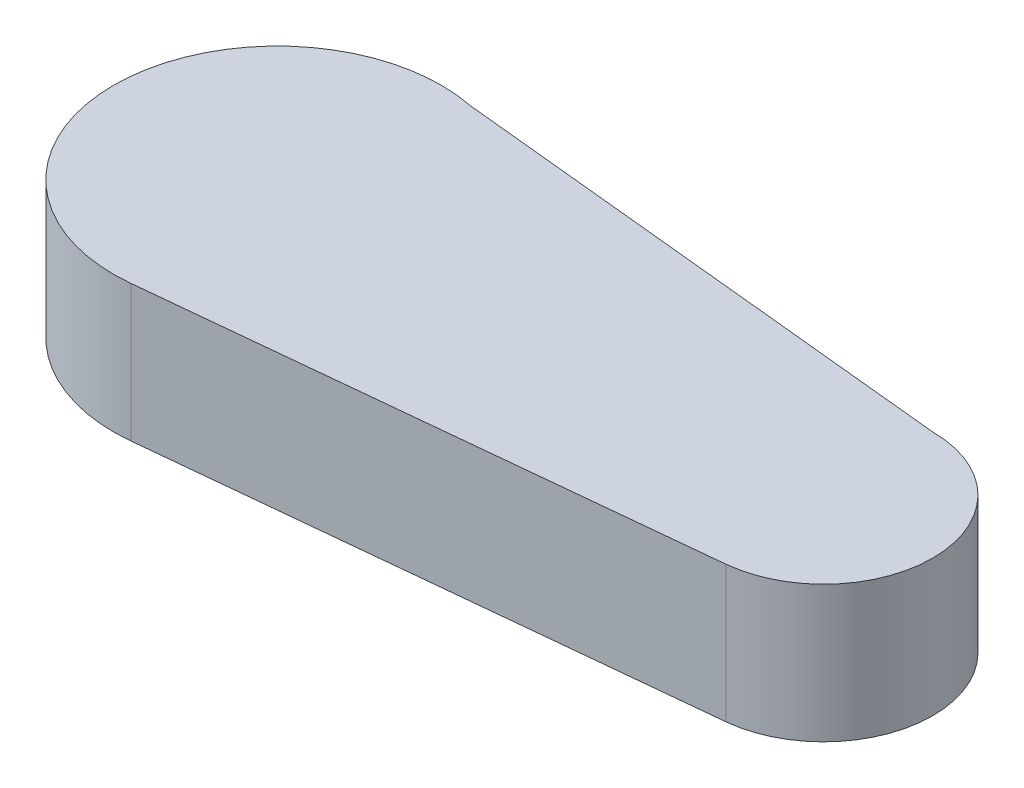
ISO-10303-21;
HEADER;
FILE_DESCRIPTION(('STEP AP214'),'2;1');
FILE_NAME('part.step','',(''),(''),'','','');
FILE_SCHEMA(('AUTOMOTIVE_DESIGN { 1 0 10303 214 1 1 1 1 }'));
ENDSEC;
DATA;
#1=APPLICATION_CONTEXT('core data for automotive mechanical design processes');
#2=APPLICATION_PROTOCOL_DEFINITION('international standard','automotive_design',2000,#1);
#3=PRODUCT_CONTEXT('',#1,'mechanical');
#4=PRODUCT('Part','Part','',(#3));
#5=PRODUCT_RELATED_PRODUCT_CATEGORY('part','',(#4));
#6=PRODUCT_DEFINITION_FORMATION('','',#4);
#7=PRODUCT_DEFINITION_CONTEXT('part definition',#1,'design');
#8=PRODUCT_DEFINITION('design','',#6,#7);
#9=PRODUCT_DEFINITION_SHAPE('','',#8);
#10=(LENGTH_UNIT() NAMED_UNIT(*) SI_UNIT(.MILLI.,.METRE.));
#11=(NAMED_UNIT(*) PLANE_ANGLE_UNIT() SI_UNIT($,.RADIAN.));
#12=(NAMED_UNIT(*) SI_UNIT($,.STERADIAN.) SOLID_ANGLE_UNIT());
#13=UNCERTAINTY_MEASURE_WITH_UNIT(LENGTH_MEASURE(1.E-05),#10,'distance_accuracy_value','');
#14=(GEOMETRIC_REPRESENTATION_CONTEXT(3) GLOBAL_UNCERTAINTY_ASSIGNED_CONTEXT((#13)) GLOBAL_UNIT_ASSIGNED_CONTEXT((#10,
#11,#12)) REPRESENTATION_CONTEXT('',''));
#15=CARTESIAN_POINT('',(0.,0.,0.));
#16=DIRECTION('',(0.,0.,1.));
#17=DIRECTION('',(1.,0.,0.));
#18=AXIS2_PLACEMENT_3D('',#15,#16,#17);
#19=CARTESIAN_POINT('',(-47.3087818696884,25.,0.));
#20=DIRECTION('',(0.,-1.,0.));
#21=DIRECTION('',(0.,0.,-1.));
#22=AXIS2_PLACEMENT_3D('',#19,#20,#21);
#23=CYLINDRICAL_SURFACE('',#22,30.);
#24=CARTESIAN_POINT('',(-47.3087818696884,0.,0.));
#25=DIRECTION('',(0.,1.,0.));
#26=DIRECTION('',(0.,0.,1.));
#27=AXIS2_PLACEMENT_3D('',#24,#25,#26);
#28=CIRCLE('',#27,30.);
#29=CARTESIAN_POINT('',(-41.3681878102824,0.,-29.4059405940594));
#30=VERTEX_POINT('',#29);
#31=CARTESIAN_POINT('',(-44.3087818696884,0.,29.8496231131986));
#32=VERTEX_POINT('',#31);
#33=EDGE_CURVE('E102',#30,#32,#28,.T.);
#34=ORIENTED_EDGE('',*,*,#33,.T.);
#35=DIRECTION('',(0.,-1.,0.));
#36=VECTOR('',#35,1.);
#37=CARTESIAN_POINT('',(-44.3087818696884,25.,29.8496231131986));
#38=LINE('',#37,#36);
#39=CARTESIAN_POINT('',(-44.3087818696884,25.,29.8496231131986));
#40=VERTEX_POINT('',#39);
#41=EDGE_CURVE('E11',#40,#32,#38,.T.);
#42=ORIENTED_EDGE('',*,*,#41,.F.);
#43=CARTESIAN_POINT('',(-47.3087818696884,25.,0.));
#44=DIRECTION('',(0.,1.,0.));
#45=DIRECTION('',(0.,0.,1.));
#46=AXIS2_PLACEMENT_3D('',#43,#44,#45);
#47=CIRCLE('',#46,30.);
#48=CARTESIAN_POINT('',(-41.3681878102824,25.,-29.4059405940594));
#49=VERTEX_POINT('',#48);
#50=EDGE_CURVE('E87',#49,#40,#47,.T.);
#51=ORIENTED_EDGE('',*,*,#50,.F.);
#52=DIRECTION('',(0.,-1.,0.));
#53=VECTOR('',#52,1.);
#54=CARTESIAN_POINT('',(-41.3681878102824,25.,-29.4059405940594));
#55=LINE('',#54,#53);
#56=EDGE_CURVE('E100',#49,#30,#55,.T.);
#57=ORIENTED_EDGE('',*,*,#56,.T.);
#58=EDGE_LOOP('',(#34,#42,#51,#57));
#59=FACE_BOUND('',#58,.T.);
#60=ADVANCED_FACE('F36',(#59),#23,.T.);
#61=CARTESIAN_POINT('',(-44.3087818696884,25.,29.8496231131986));
#62=DIRECTION('',(-0.1,0.,-0.99498743710662));
#63=DIRECTION('',(-0.99498743710662,0.,0.1));
#64=AXIS2_PLACEMENT_3D('',#61,#62,#63);
#65=PLANE('',#64);
#66=DIRECTION('',(0.99498743710662,0.,-0.1));
#67=VECTOR('',#66,1.);
#68=CARTESIAN_POINT('',(-44.3087818696884,0.,29.8496231131986));
#69=LINE('',#68,#67);
#70=CARTESIAN_POINT('',(54.6912181303116,0.,19.8997487421324));
#71=VERTEX_POINT('',#70);
#72=EDGE_CURVE('E93',#32,#71,#69,.T.);
#73=ORIENTED_EDGE('',*,*,#72,.T.);
#74=DIRECTION('',(0.,-1.,0.));
#75=VECTOR('',#74,1.);
#76=CARTESIAN_POINT('',(54.6912181303116,25.,19.8997487421324));
#77=LINE('',#76,#75);
#78=CARTESIAN_POINT('',(54.6912181303116,25.,19.8997487421324));
#79=VERTEX_POINT('',#78);
#80=EDGE_CURVE('E46',#79,#71,#77,.T.);
#81=ORIENTED_EDGE('',*,*,#80,.F.);
#82=DIRECTION('',(0.99498743710662,0.,-0.1));
#83=VECTOR('',#82,1.);
#84=CARTESIAN_POINT('',(-44.3087818696884,25.,29.8496231131986));
#85=LINE('',#84,#83);
#86=EDGE_CURVE('E84',#40,#79,#85,.T.);
#87=ORIENTED_EDGE('',*,*,#86,.F.);
#88=ORIENTED_EDGE('',*,*,#41,.T.);
#89=EDGE_LOOP('',(#73,#81,#87,#88));
#90=FACE_BOUND('',#89,.T.);
#91=ADVANCED_FACE('F95',(#90),#65,.F.);
#92=CARTESIAN_POINT('',(52.6912181303116,25.,0.));
#93=DIRECTION('',(0.,-1.,0.));
#94=DIRECTION('',(0.,0.,-1.));
#95=AXIS2_PLACEMENT_3D('',#92,#93,#94);
#96=CYLINDRICAL_SURFACE('',#95,20.);
#97=CARTESIAN_POINT('',(52.6912181303116,0.,0.));
#98=DIRECTION('',(0.,1.,0.));
#99=DIRECTION('',(0.,0.,1.));
#100=AXIS2_PLACEMENT_3D('',#97,#98,#99);
#101=CIRCLE('',#100,20.);
#102=CARTESIAN_POINT('',(52.6912181303116,0.,-20.));
#103=VERTEX_POINT('',#102);
#104=EDGE_CURVE('E71',#71,#103,#101,.T.);
#105=ORIENTED_EDGE('',*,*,#104,.T.);
#106=DIRECTION('',(0.,-1.,0.));
#107=VECTOR('',#106,1.);
#108=CARTESIAN_POINT('',(52.6912181303116,25.,-20.));
#109=LINE('',#108,#107);
#110=CARTESIAN_POINT('',(52.6912181303116,25.,-20.));
#111=VERTEX_POINT('',#110);
#112=EDGE_CURVE('E92',#111,#103,#109,.T.);
#113=ORIENTED_EDGE('',*,*,#112,.F.);
#114=CARTESIAN_POINT('',(52.6912181303116,25.,0.));
#115=DIRECTION('',(0.,1.,0.));
#116=DIRECTION('',(0.,0.,1.));
#117=AXIS2_PLACEMENT_3D('',#114,#115,#116);
#118=CIRCLE('',#117,20.);
#119=EDGE_CURVE('E90',#79,#111,#118,.T.);
#120=ORIENTED_EDGE('',*,*,#119,.F.);
#121=ORIENTED_EDGE('',*,*,#80,.T.);
#122=EDGE_LOOP('',(#105,#113,#120,#121));
#123=FACE_BOUND('',#122,.T.);
#124=ADVANCED_FACE('F94',(#123),#96,.T.);
#125=CARTESIAN_POINT('',(-41.3681878102824,25.,-29.4059405940594));
#126=DIRECTION('',(-0.0995037190209988,0.,0.995037190209989));
#127=DIRECTION('',(0.995037190209989,0.,0.0995037190209988));
#128=AXIS2_PLACEMENT_3D('',#125,#126,#127);
#129=PLANE('',#128);
#130=DIRECTION('',(-0.995037190209989,0.,-0.0995037190209988));
#131=VECTOR('',#130,1.);
#132=CARTESIAN_POINT('',(-41.3681878102824,0.,-29.4059405940594));
#133=LINE('',#132,#131);
#134=EDGE_CURVE('E77',#103,#30,#133,.T.);
#135=ORIENTED_EDGE('',*,*,#134,.T.);
#136=ORIENTED_EDGE('',*,*,#56,.F.);
#137=DIRECTION('',(-0.995037190209989,0.,-0.0995037190209988));
#138=VECTOR('',#137,1.);
#139=CARTESIAN_POINT('',(-41.3681878102824,25.,-29.4059405940594));
#140=LINE('',#139,#138);
#141=EDGE_CURVE('E53',#111,#49,#140,.T.);
#142=ORIENTED_EDGE('',*,*,#141,.F.);
#143=ORIENTED_EDGE('',*,*,#112,.T.);
#144=EDGE_LOOP('',(#135,#136,#142,#143));
#145=FACE_BOUND('',#144,.T.);
#146=ADVANCED_FACE('F106',(#145),#129,.F.);
#147=CARTESIAN_POINT('',(-47.3087818696884,25.,0.));
#148=DIRECTION('',(0.,1.,0.));
#149=DIRECTION('',(0.,0.,1.));
#150=AXIS2_PLACEMENT_3D('',#147,#148,#149);
#151=PLANE('',#150);
#152=ORIENTED_EDGE('',*,*,#50,.T.);
#153=ORIENTED_EDGE('',*,*,#86,.T.);
#154=ORIENTED_EDGE('',*,*,#119,.T.);
#155=ORIENTED_EDGE('',*,*,#141,.T.);
#156=EDGE_LOOP('',(#152,#153,#154,#155));
#157=FACE_BOUND('',#156,.T.);
#158=ADVANCED_FACE('F82',(#157),#151,.T.);
#159=CARTESIAN_POINT('',(-47.3087818696884,0.,0.));
#160=DIRECTION('',(0.,1.,0.));
#161=DIRECTION('',(0.,0.,1.));
#162=AXIS2_PLACEMENT_3D('',#159,#160,#161);
#163=PLANE('',#162);
#164=ORIENTED_EDGE('',*,*,#33,.F.);
#165=ORIENTED_EDGE('',*,*,#134,.F.);
#166=ORIENTED_EDGE('',*,*,#104,.F.);
#167=ORIENTED_EDGE('',*,*,#72,.F.);
#168=EDGE_LOOP('',(#164,#165,#166,#167));
#169=FACE_BOUND('',#168,.T.);
#170=ADVANCED_FACE('F112',(#169),#163,.F.);
#171=CLOSED_SHELL('',(#60,#91,#124,#146,#158,#170));
#172=MANIFOLD_SOLID_BREP('B2',#171);
#173=ADVANCED_BREP_SHAPE_REPRESENTATION('',(#18,#172),#14);
#174=SHAPE_DEFINITION_REPRESENTATION(#9,#173);
ENDSEC;
END-ISO-10303-21;
